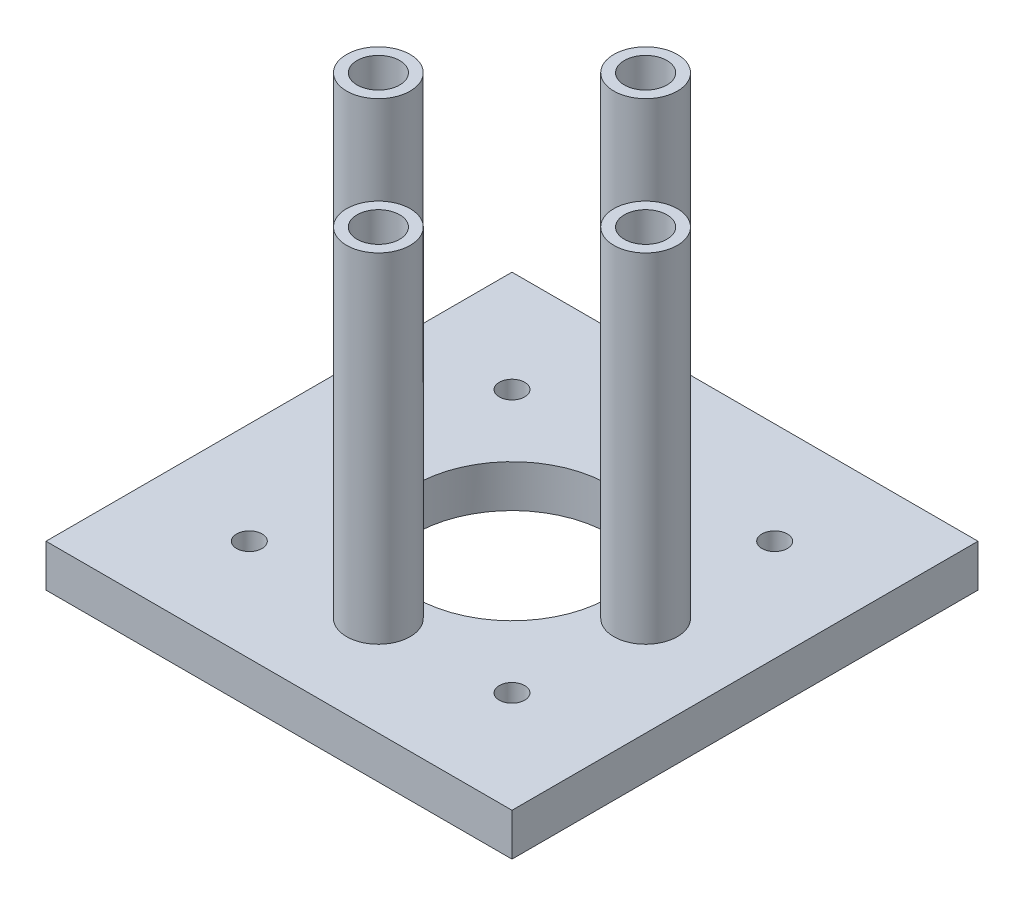
ISO-10303-21;
HEADER;
FILE_DESCRIPTION(('STEP AP214'),'2;1');
FILE_NAME('part.step','',(''),(''),'','','');
FILE_SCHEMA(('AUTOMOTIVE_DESIGN { 1 0 10303 214 1 1 1 1 }'));
ENDSEC;
DATA;
#1=APPLICATION_CONTEXT('core data for automotive mechanical design processes');
#2=APPLICATION_PROTOCOL_DEFINITION('international standard','automotive_design',2000,#1);
#3=PRODUCT_CONTEXT('',#1,'mechanical');
#4=PRODUCT('Part','Part','',(#3));
#5=PRODUCT_RELATED_PRODUCT_CATEGORY('part','',(#4));
#6=PRODUCT_DEFINITION_FORMATION('','',#4);
#7=PRODUCT_DEFINITION_CONTEXT('part definition',#1,'design');
#8=PRODUCT_DEFINITION('design','',#6,#7);
#9=PRODUCT_DEFINITION_SHAPE('','',#8);
#10=(LENGTH_UNIT() NAMED_UNIT(*) SI_UNIT(.MILLI.,.METRE.));
#11=(NAMED_UNIT(*) PLANE_ANGLE_UNIT() SI_UNIT($,.RADIAN.));
#12=(NAMED_UNIT(*) SI_UNIT($,.STERADIAN.) SOLID_ANGLE_UNIT());
#13=UNCERTAINTY_MEASURE_WITH_UNIT(LENGTH_MEASURE(1.E-05),#10,'distance_accuracy_value','');
#14=(GEOMETRIC_REPRESENTATION_CONTEXT(3) GLOBAL_UNCERTAINTY_ASSIGNED_CONTEXT((#13)) GLOBAL_UNIT_ASSIGNED_CONTEXT((#10,
#11,#12)) REPRESENTATION_CONTEXT('',''));
#15=CARTESIAN_POINT('',(0.,0.,0.));
#16=DIRECTION('',(0.,0.,1.));
#17=DIRECTION('',(1.,0.,0.));
#18=AXIS2_PLACEMENT_3D('',#15,#16,#17);
#19=CARTESIAN_POINT('',(0.,5.,0.));
#20=DIRECTION('',(0.,-1.,0.));
#21=DIRECTION('',(0.,0.,-1.));
#22=AXIS2_PLACEMENT_3D('',#19,#20,#21);
#23=PLANE('',#22);
#24=CARTESIAN_POINT('',(0.,5.,0.));
#25=DIRECTION('',(0.,1.,0.));
#26=DIRECTION('',(0.,0.,1.));
#27=AXIS2_PLACEMENT_3D('',#24,#25,#26);
#28=CIRCLE('',#27,11.5);
#29=CARTESIAN_POINT('',(0.,5.,11.5));
#30=VERTEX_POINT('',#29);
#31=EDGE_CURVE('E307',#30,#30,#28,.T.);
#32=ORIENTED_EDGE('',*,*,#31,.F.);
#33=EDGE_LOOP('',(#32));
#34=FACE_BOUND('',#33,.T.);
#35=CARTESIAN_POINT('',(0.,5.,-15.77));
#36=DIRECTION('',(0.,-1.,0.));
#37=DIRECTION('',(0.,0.,-1.));
#38=AXIS2_PLACEMENT_3D('',#35,#36,#37);
#39=CIRCLE('',#38,3.75000000000001);
#40=CARTESIAN_POINT('',(0.,5.,-19.52));
#41=VERTEX_POINT('',#40);
#42=EDGE_CURVE('E11',#41,#41,#39,.F.);
#43=ORIENTED_EDGE('',*,*,#42,.F.);
#44=EDGE_LOOP('',(#43));
#45=FACE_BOUND('',#44,.T.);
#46=CARTESIAN_POINT('',(0.,5.,15.77));
#47=DIRECTION('',(0.,-1.,0.));
#48=DIRECTION('',(0.,0.,-1.));
#49=AXIS2_PLACEMENT_3D('',#46,#47,#48);
#50=CIRCLE('',#49,3.75000000000001);
#51=CARTESIAN_POINT('',(0.,5.,12.02));
#52=VERTEX_POINT('',#51);
#53=EDGE_CURVE('E54',#52,#52,#50,.F.);
#54=ORIENTED_EDGE('',*,*,#53,.F.);
#55=EDGE_LOOP('',(#54));
#56=FACE_BOUND('',#55,.T.);
#57=CARTESIAN_POINT('',(15.77,5.,0.));
#58=DIRECTION('',(0.,-1.,0.));
#59=DIRECTION('',(0.,0.,-1.));
#60=AXIS2_PLACEMENT_3D('',#57,#58,#59);
#61=CIRCLE('',#60,3.75000000000001);
#62=CARTESIAN_POINT('',(15.77,5.,-3.75000000000001));
#63=VERTEX_POINT('',#62);
#64=EDGE_CURVE('E138',#63,#63,#61,.F.);
#65=ORIENTED_EDGE('',*,*,#64,.F.);
#66=EDGE_LOOP('',(#65));
#67=FACE_BOUND('',#66,.T.);
#68=CARTESIAN_POINT('',(-15.77,5.,0.));
#69=DIRECTION('',(0.,-1.,0.));
#70=DIRECTION('',(0.,0.,-1.));
#71=AXIS2_PLACEMENT_3D('',#68,#69,#70);
#72=CIRCLE('',#71,3.75000000000001);
#73=CARTESIAN_POINT('',(-15.77,5.,-3.75000000000001));
#74=VERTEX_POINT('',#73);
#75=EDGE_CURVE('E134',#74,#74,#72,.F.);
#76=ORIENTED_EDGE('',*,*,#75,.F.);
#77=EDGE_LOOP('',(#76));
#78=FACE_BOUND('',#77,.T.);
#79=DIRECTION('',(0.,0.,-1.));
#80=VECTOR('',#79,1.);
#81=CARTESIAN_POINT('',(27.5,5.,27.5));
#82=LINE('',#81,#80);
#83=CARTESIAN_POINT('',(27.5,5.,27.5));
#84=VERTEX_POINT('',#83);
#85=CARTESIAN_POINT('',(27.5,5.,-27.5));
#86=VERTEX_POINT('',#85);
#87=EDGE_CURVE('E98',#84,#86,#82,.T.);
#88=ORIENTED_EDGE('',*,*,#87,.T.);
#89=DIRECTION('',(-1.,0.,0.));
#90=VECTOR('',#89,1.);
#91=CARTESIAN_POINT('',(-27.5,5.,-27.5));
#92=LINE('',#91,#90);
#93=CARTESIAN_POINT('',(-27.5,5.,-27.5));
#94=VERTEX_POINT('',#93);
#95=EDGE_CURVE('E93',#86,#94,#92,.T.);
#96=ORIENTED_EDGE('',*,*,#95,.T.);
#97=DIRECTION('',(0.,0.,1.));
#98=VECTOR('',#97,1.);
#99=CARTESIAN_POINT('',(-27.5,5.,27.5));
#100=LINE('',#99,#98);
#101=CARTESIAN_POINT('',(-27.5,5.,27.5));
#102=VERTEX_POINT('',#101);
#103=EDGE_CURVE('E96',#94,#102,#100,.T.);
#104=ORIENTED_EDGE('',*,*,#103,.T.);
#105=DIRECTION('',(1.,0.,0.));
#106=VECTOR('',#105,1.);
#107=CARTESIAN_POINT('',(-27.5,5.,27.5));
#108=LINE('',#107,#106);
#109=EDGE_CURVE('E62',#102,#84,#108,.T.);
#110=ORIENTED_EDGE('',*,*,#109,.T.);
#111=EDGE_LOOP('',(#88,#96,#104,#110));
#112=FACE_BOUND('',#111,.T.);
#113=CARTESIAN_POINT('',(-15.5,5.,-15.5));
#114=DIRECTION('',(0.,1.,0.));
#115=DIRECTION('',(0.,0.,1.));
#116=AXIS2_PLACEMENT_3D('',#113,#114,#115);
#117=CIRCLE('',#116,1.5);
#118=CARTESIAN_POINT('',(-15.5,5.,-14.));
#119=VERTEX_POINT('',#118);
#120=EDGE_CURVE('E121',#119,#119,#117,.T.);
#121=ORIENTED_EDGE('',*,*,#120,.F.);
#122=EDGE_LOOP('',(#121));
#123=FACE_BOUND('',#122,.T.);
#124=CARTESIAN_POINT('',(-15.5,5.,15.5));
#125=DIRECTION('',(0.,1.,0.));
#126=DIRECTION('',(0.,0.,-1.));
#127=AXIS2_PLACEMENT_3D('',#124,#125,#126);
#128=CIRCLE('',#127,1.5);
#129=CARTESIAN_POINT('',(-15.5,5.,14.));
#130=VERTEX_POINT('',#129);
#131=EDGE_CURVE('E236',#130,#130,#128,.T.);
#132=ORIENTED_EDGE('',*,*,#131,.F.);
#133=EDGE_LOOP('',(#132));
#134=FACE_BOUND('',#133,.T.);
#135=CARTESIAN_POINT('',(15.5,5.,15.5));
#136=DIRECTION('',(0.,1.,0.));
#137=DIRECTION('',(0.,0.,1.));
#138=AXIS2_PLACEMENT_3D('',#135,#136,#137);
#139=CIRCLE('',#138,1.5);
#140=CARTESIAN_POINT('',(15.5,5.,17.));
#141=VERTEX_POINT('',#140);
#142=EDGE_CURVE('E229',#141,#141,#139,.T.);
#143=ORIENTED_EDGE('',*,*,#142,.F.);
#144=EDGE_LOOP('',(#143));
#145=FACE_BOUND('',#144,.T.);
#146=CARTESIAN_POINT('',(15.5,5.,-15.5));
#147=DIRECTION('',(0.,1.,0.));
#148=DIRECTION('',(0.,0.,-1.));
#149=AXIS2_PLACEMENT_3D('',#146,#147,#148);
#150=CIRCLE('',#149,1.5);
#151=CARTESIAN_POINT('',(15.5,5.,-17.));
#152=VERTEX_POINT('',#151);
#153=EDGE_CURVE('E217',#152,#152,#150,.T.);
#154=ORIENTED_EDGE('',*,*,#153,.F.);
#155=EDGE_LOOP('',(#154));
#156=FACE_BOUND('',#155,.T.);
#157=ADVANCED_FACE('F43',(#34,#45,#56,#67,#78,#112,#123,#134,#145,#156),#23,.F.);
#158=CARTESIAN_POINT('',(0.,0.,0.));
#159=DIRECTION('',(0.,-1.,0.));
#160=DIRECTION('',(0.,0.,-1.));
#161=AXIS2_PLACEMENT_3D('',#158,#159,#160);
#162=PLANE('',#161);
#163=CARTESIAN_POINT('',(0.,0.,0.));
#164=DIRECTION('',(0.,-1.,0.));
#165=DIRECTION('',(0.,0.,-1.));
#166=AXIS2_PLACEMENT_3D('',#163,#164,#165);
#167=CIRCLE('',#166,11.5);
#168=CARTESIAN_POINT('',(0.,0.,-11.5));
#169=VERTEX_POINT('',#168);
#170=EDGE_CURVE('E47',#169,#169,#167,.T.);
#171=ORIENTED_EDGE('',*,*,#170,.F.);
#172=EDGE_LOOP('',(#171));
#173=FACE_BOUND('',#172,.T.);
#174=CARTESIAN_POINT('',(15.5,0.,15.5));
#175=DIRECTION('',(0.,1.,0.));
#176=DIRECTION('',(0.,0.,1.));
#177=AXIS2_PLACEMENT_3D('',#174,#175,#176);
#178=CIRCLE('',#177,1.5);
#179=CARTESIAN_POINT('',(15.5,0.,17.));
#180=VERTEX_POINT('',#179);
#181=EDGE_CURVE('E223',#180,#180,#178,.T.);
#182=ORIENTED_EDGE('',*,*,#181,.T.);
#183=EDGE_LOOP('',(#182));
#184=FACE_BOUND('',#183,.T.);
#185=CARTESIAN_POINT('',(-15.5,0.,-15.5));
#186=DIRECTION('',(0.,1.,0.));
#187=DIRECTION('',(0.,0.,1.));
#188=AXIS2_PLACEMENT_3D('',#185,#186,#187);
#189=CIRCLE('',#188,1.5);
#190=CARTESIAN_POINT('',(-15.5,0.,-14.));
#191=VERTEX_POINT('',#190);
#192=EDGE_CURVE('E240',#191,#191,#189,.T.);
#193=ORIENTED_EDGE('',*,*,#192,.T.);
#194=EDGE_LOOP('',(#193));
#195=FACE_BOUND('',#194,.T.);
#196=DIRECTION('',(0.,0.,-1.));
#197=VECTOR('',#196,1.);
#198=CARTESIAN_POINT('',(27.5,0.,27.5));
#199=LINE('',#198,#197);
#200=CARTESIAN_POINT('',(27.5,0.,27.5));
#201=VERTEX_POINT('',#200);
#202=CARTESIAN_POINT('',(27.5,0.,-27.5));
#203=VERTEX_POINT('',#202);
#204=EDGE_CURVE('E117',#201,#203,#199,.T.);
#205=ORIENTED_EDGE('',*,*,#204,.F.);
#206=DIRECTION('',(1.,0.,0.));
#207=VECTOR('',#206,1.);
#208=CARTESIAN_POINT('',(-27.5,0.,27.5));
#209=LINE('',#208,#207);
#210=CARTESIAN_POINT('',(-27.5,0.,27.5));
#211=VERTEX_POINT('',#210);
#212=EDGE_CURVE('E85',#211,#201,#209,.T.);
#213=ORIENTED_EDGE('',*,*,#212,.F.);
#214=DIRECTION('',(0.,0.,1.));
#215=VECTOR('',#214,1.);
#216=CARTESIAN_POINT('',(-27.5,0.,27.5));
#217=LINE('',#216,#215);
#218=CARTESIAN_POINT('',(-27.5,0.,-27.5));
#219=VERTEX_POINT('',#218);
#220=EDGE_CURVE('E79',#219,#211,#217,.T.);
#221=ORIENTED_EDGE('',*,*,#220,.F.);
#222=DIRECTION('',(-1.,0.,0.));
#223=VECTOR('',#222,1.);
#224=CARTESIAN_POINT('',(-27.5,0.,-27.5));
#225=LINE('',#224,#223);
#226=EDGE_CURVE('E104',#203,#219,#225,.T.);
#227=ORIENTED_EDGE('',*,*,#226,.F.);
#228=EDGE_LOOP('',(#205,#213,#221,#227));
#229=FACE_BOUND('',#228,.T.);
#230=CARTESIAN_POINT('',(-15.5,0.,15.5));
#231=DIRECTION('',(0.,1.,0.));
#232=DIRECTION('',(0.,0.,-1.));
#233=AXIS2_PLACEMENT_3D('',#230,#231,#232);
#234=CIRCLE('',#233,1.5);
#235=CARTESIAN_POINT('',(-15.5,0.,14.));
#236=VERTEX_POINT('',#235);
#237=EDGE_CURVE('E211',#236,#236,#234,.T.);
#238=ORIENTED_EDGE('',*,*,#237,.T.);
#239=EDGE_LOOP('',(#238));
#240=FACE_BOUND('',#239,.T.);
#241=CARTESIAN_POINT('',(15.5,0.,-15.5));
#242=DIRECTION('',(0.,1.,0.));
#243=DIRECTION('',(0.,0.,-1.));
#244=AXIS2_PLACEMENT_3D('',#241,#242,#243);
#245=CIRCLE('',#244,1.5);
#246=CARTESIAN_POINT('',(15.5,0.,-17.));
#247=VERTEX_POINT('',#246);
#248=EDGE_CURVE('E214',#247,#247,#245,.T.);
#249=ORIENTED_EDGE('',*,*,#248,.T.);
#250=EDGE_LOOP('',(#249));
#251=FACE_BOUND('',#250,.T.);
#252=ADVANCED_FACE('F150',(#173,#184,#195,#229,#240,#251),#162,.T.);
#253=CARTESIAN_POINT('',(27.5,5.,27.5));
#254=DIRECTION('',(-1.,0.,0.));
#255=DIRECTION('',(0.,0.,1.));
#256=AXIS2_PLACEMENT_3D('',#253,#254,#255);
#257=PLANE('',#256);
#258=ORIENTED_EDGE('',*,*,#204,.T.);
#259=DIRECTION('',(0.,-1.,0.));
#260=VECTOR('',#259,1.);
#261=CARTESIAN_POINT('',(27.5,5.,-27.5));
#262=LINE('',#261,#260);
#263=EDGE_CURVE('E106',#86,#203,#262,.T.);
#264=ORIENTED_EDGE('',*,*,#263,.F.);
#265=ORIENTED_EDGE('',*,*,#87,.F.);
#266=DIRECTION('',(0.,-1.,0.));
#267=VECTOR('',#266,1.);
#268=CARTESIAN_POINT('',(27.5,5.,27.5));
#269=LINE('',#268,#267);
#270=EDGE_CURVE('E113',#84,#201,#269,.T.);
#271=ORIENTED_EDGE('',*,*,#270,.T.);
#272=EDGE_LOOP('',(#258,#264,#265,#271));
#273=FACE_BOUND('',#272,.T.);
#274=ADVANCED_FACE('F45',(#273),#257,.F.);
#275=CARTESIAN_POINT('',(-27.5,5.,-27.5));
#276=DIRECTION('',(0.,0.,1.));
#277=DIRECTION('',(1.,0.,0.));
#278=AXIS2_PLACEMENT_3D('',#275,#276,#277);
#279=PLANE('',#278);
#280=ORIENTED_EDGE('',*,*,#226,.T.);
#281=DIRECTION('',(0.,-1.,0.));
#282=VECTOR('',#281,1.);
#283=CARTESIAN_POINT('',(-27.5,5.,-27.5));
#284=LINE('',#283,#282);
#285=EDGE_CURVE('E102',#94,#219,#284,.T.);
#286=ORIENTED_EDGE('',*,*,#285,.F.);
#287=ORIENTED_EDGE('',*,*,#95,.F.);
#288=ORIENTED_EDGE('',*,*,#263,.T.);
#289=EDGE_LOOP('',(#280,#286,#287,#288));
#290=FACE_BOUND('',#289,.T.);
#291=ADVANCED_FACE('F103',(#290),#279,.F.);
#292=CARTESIAN_POINT('',(-27.5,5.,27.5));
#293=DIRECTION('',(1.,0.,0.));
#294=DIRECTION('',(0.,0.,-1.));
#295=AXIS2_PLACEMENT_3D('',#292,#293,#294);
#296=PLANE('',#295);
#297=ORIENTED_EDGE('',*,*,#220,.T.);
#298=DIRECTION('',(0.,-1.,0.));
#299=VECTOR('',#298,1.);
#300=CARTESIAN_POINT('',(-27.5,5.,27.5));
#301=LINE('',#300,#299);
#302=EDGE_CURVE('E107',#102,#211,#301,.T.);
#303=ORIENTED_EDGE('',*,*,#302,.F.);
#304=ORIENTED_EDGE('',*,*,#103,.F.);
#305=ORIENTED_EDGE('',*,*,#285,.T.);
#306=EDGE_LOOP('',(#297,#303,#304,#305));
#307=FACE_BOUND('',#306,.T.);
#308=ADVANCED_FACE('F109',(#307),#296,.F.);
#309=CARTESIAN_POINT('',(-27.5,5.,27.5));
#310=DIRECTION('',(0.,0.,-1.));
#311=DIRECTION('',(-1.,0.,0.));
#312=AXIS2_PLACEMENT_3D('',#309,#310,#311);
#313=PLANE('',#312);
#314=ORIENTED_EDGE('',*,*,#212,.T.);
#315=ORIENTED_EDGE('',*,*,#270,.F.);
#316=ORIENTED_EDGE('',*,*,#109,.F.);
#317=ORIENTED_EDGE('',*,*,#302,.T.);
#318=EDGE_LOOP('',(#314,#315,#316,#317));
#319=FACE_BOUND('',#318,.T.);
#320=ADVANCED_FACE('F189',(#319),#313,.F.);
#321=CARTESIAN_POINT('',(-15.5,5.,-15.5));
#322=DIRECTION('',(0.,-1.,0.));
#323=DIRECTION('',(0.,0.,-1.));
#324=AXIS2_PLACEMENT_3D('',#321,#322,#323);
#325=CYLINDRICAL_SURFACE('',#324,1.5);
#326=ORIENTED_EDGE('',*,*,#120,.T.);
#327=EDGE_LOOP('',(#326));
#328=FACE_BOUND('',#327,.T.);
#329=ORIENTED_EDGE('',*,*,#192,.F.);
#330=EDGE_LOOP('',(#329));
#331=FACE_BOUND('',#330,.T.);
#332=ADVANCED_FACE('F186',(#328,#331),#325,.F.);
#333=CARTESIAN_POINT('',(-15.5,5.,15.5));
#334=DIRECTION('',(0.,-1.,0.));
#335=DIRECTION('',(0.,0.,-1.));
#336=AXIS2_PLACEMENT_3D('',#333,#334,#335);
#337=CYLINDRICAL_SURFACE('',#336,1.5);
#338=ORIENTED_EDGE('',*,*,#131,.T.);
#339=EDGE_LOOP('',(#338));
#340=FACE_BOUND('',#339,.T.);
#341=ORIENTED_EDGE('',*,*,#237,.F.);
#342=EDGE_LOOP('',(#341));
#343=FACE_BOUND('',#342,.T.);
#344=ADVANCED_FACE('F182',(#340,#343),#337,.F.);
#345=CARTESIAN_POINT('',(15.5,5.,15.5));
#346=DIRECTION('',(0.,-1.,0.));
#347=DIRECTION('',(0.,0.,-1.));
#348=AXIS2_PLACEMENT_3D('',#345,#346,#347);
#349=CYLINDRICAL_SURFACE('',#348,1.5);
#350=ORIENTED_EDGE('',*,*,#142,.T.);
#351=EDGE_LOOP('',(#350));
#352=FACE_BOUND('',#351,.T.);
#353=ORIENTED_EDGE('',*,*,#181,.F.);
#354=EDGE_LOOP('',(#353));
#355=FACE_BOUND('',#354,.T.);
#356=ADVANCED_FACE('F178',(#352,#355),#349,.F.);
#357=CARTESIAN_POINT('',(15.5,5.,-15.5));
#358=DIRECTION('',(0.,-1.,0.));
#359=DIRECTION('',(0.,0.,-1.));
#360=AXIS2_PLACEMENT_3D('',#357,#358,#359);
#361=CYLINDRICAL_SURFACE('',#360,1.5);
#362=ORIENTED_EDGE('',*,*,#153,.T.);
#363=EDGE_LOOP('',(#362));
#364=FACE_BOUND('',#363,.T.);
#365=ORIENTED_EDGE('',*,*,#248,.F.);
#366=EDGE_LOOP('',(#365));
#367=FACE_BOUND('',#366,.T.);
#368=ADVANCED_FACE('F171',(#364,#367),#361,.F.);
#369=CARTESIAN_POINT('',(-15.77,45.,0.));
#370=DIRECTION('',(0.,1.,0.));
#371=DIRECTION('',(0.,0.,1.));
#372=AXIS2_PLACEMENT_3D('',#369,#370,#371);
#373=PLANE('',#372);
#374=CARTESIAN_POINT('',(-15.77,45.,0.));
#375=DIRECTION('',(0.,1.,0.));
#376=DIRECTION('',(0.,0.,1.));
#377=AXIS2_PLACEMENT_3D('',#374,#375,#376);
#378=CIRCLE('',#377,3.75000000000001);
#379=CARTESIAN_POINT('',(-15.77,45.,3.75000000000001));
#380=VERTEX_POINT('',#379);
#381=EDGE_CURVE('E218',#380,#380,#378,.T.);
#382=ORIENTED_EDGE('',*,*,#381,.T.);
#383=EDGE_LOOP('',(#382));
#384=FACE_BOUND('',#383,.T.);
#385=CARTESIAN_POINT('',(-15.77,45.,0.));
#386=DIRECTION('',(0.,1.,0.));
#387=DIRECTION('',(0.,0.,1.));
#388=AXIS2_PLACEMENT_3D('',#385,#386,#387);
#389=CIRCLE('',#388,2.51184584015954);
#390=CARTESIAN_POINT('',(-15.77,45.,2.51184584015954));
#391=VERTEX_POINT('',#390);
#392=EDGE_CURVE('E226',#391,#391,#389,.T.);
#393=ORIENTED_EDGE('',*,*,#392,.F.);
#394=EDGE_LOOP('',(#393));
#395=FACE_BOUND('',#394,.T.);
#396=ADVANCED_FACE('F162',(#384,#395),#373,.T.);
#397=CARTESIAN_POINT('',(-15.77,45.,0.));
#398=DIRECTION('',(0.,-1.,0.));
#399=DIRECTION('',(0.,0.,-1.));
#400=AXIS2_PLACEMENT_3D('',#397,#398,#399);
#401=CYLINDRICAL_SURFACE('',#400,3.75000000000001);
#402=ORIENTED_EDGE('',*,*,#381,.F.);
#403=EDGE_LOOP('',(#402));
#404=FACE_BOUND('',#403,.T.);
#405=ORIENTED_EDGE('',*,*,#75,.T.);
#406=EDGE_LOOP('',(#405));
#407=FACE_BOUND('',#406,.T.);
#408=ADVANCED_FACE('F159',(#404,#407),#401,.T.);
#409=CARTESIAN_POINT('',(-15.77,45.,0.));
#410=DIRECTION('',(0.,-1.,0.));
#411=DIRECTION('',(0.,0.,-1.));
#412=AXIS2_PLACEMENT_3D('',#409,#410,#411);
#413=CYLINDRICAL_SURFACE('',#412,2.51184584015954);
#414=ORIENTED_EDGE('',*,*,#392,.T.);
#415=EDGE_LOOP('',(#414));
#416=FACE_BOUND('',#415,.T.);
#417=CARTESIAN_POINT('',(-15.77,5.,0.));
#418=DIRECTION('',(0.,1.,0.));
#419=DIRECTION('',(0.,0.,1.));
#420=AXIS2_PLACEMENT_3D('',#417,#418,#419);
#421=CIRCLE('',#420,2.51184584015954);
#422=CARTESIAN_POINT('',(-15.77,5.,2.51184584015954));
#423=VERTEX_POINT('',#422);
#424=EDGE_CURVE('E264',#423,#423,#421,.T.);
#425=ORIENTED_EDGE('',*,*,#424,.F.);
#426=EDGE_LOOP('',(#425));
#427=FACE_BOUND('',#426,.T.);
#428=ADVANCED_FACE('F161',(#416,#427),#413,.F.);
#429=ORIENTED_EDGE('',*,*,#424,.T.);
#430=EDGE_LOOP('',(#429));
#431=FACE_BOUND('',#430,.T.);
#432=ADVANCED_FACE('F154',(#431),#23,.F.);
#433=CARTESIAN_POINT('',(15.77,45.,0.));
#434=DIRECTION('',(0.,-1.,0.));
#435=DIRECTION('',(0.,0.,-1.));
#436=AXIS2_PLACEMENT_3D('',#433,#434,#435);
#437=PLANE('',#436);
#438=CARTESIAN_POINT('',(15.77,45.,0.));
#439=DIRECTION('',(0.,1.,0.));
#440=DIRECTION('',(0.,0.,-1.));
#441=AXIS2_PLACEMENT_3D('',#438,#439,#440);
#442=CIRCLE('',#441,3.75000000000001);
#443=CARTESIAN_POINT('',(15.77,45.,-3.75000000000001));
#444=VERTEX_POINT('',#443);
#445=EDGE_CURVE('E276',#444,#444,#442,.T.);
#446=ORIENTED_EDGE('',*,*,#445,.T.);
#447=EDGE_LOOP('',(#446));
#448=FACE_BOUND('',#447,.T.);
#449=CARTESIAN_POINT('',(15.77,45.,0.));
#450=DIRECTION('',(0.,1.,0.));
#451=DIRECTION('',(0.,0.,-1.));
#452=AXIS2_PLACEMENT_3D('',#449,#450,#451);
#453=CIRCLE('',#452,2.51184584015954);
#454=CARTESIAN_POINT('',(15.77,45.,-2.51184584015954));
#455=VERTEX_POINT('',#454);
#456=EDGE_CURVE('E272',#455,#455,#453,.T.);
#457=ORIENTED_EDGE('',*,*,#456,.F.);
#458=EDGE_LOOP('',(#457));
#459=FACE_BOUND('',#458,.T.);
#460=ADVANCED_FACE('F353',(#448,#459),#437,.F.);
#461=CARTESIAN_POINT('',(15.77,45.,0.));
#462=DIRECTION('',(0.,-1.,0.));
#463=DIRECTION('',(0.,0.,-1.));
#464=AXIS2_PLACEMENT_3D('',#461,#462,#463);
#465=CYLINDRICAL_SURFACE('',#464,3.75000000000001);
#466=ORIENTED_EDGE('',*,*,#445,.F.);
#467=EDGE_LOOP('',(#466));
#468=FACE_BOUND('',#467,.T.);
#469=ORIENTED_EDGE('',*,*,#64,.T.);
#470=EDGE_LOOP('',(#469));
#471=FACE_BOUND('',#470,.T.);
#472=ADVANCED_FACE('F349',(#468,#471),#465,.T.);
#473=CARTESIAN_POINT('',(15.77,45.,0.));
#474=DIRECTION('',(0.,-1.,0.));
#475=DIRECTION('',(0.,0.,-1.));
#476=AXIS2_PLACEMENT_3D('',#473,#474,#475);
#477=CYLINDRICAL_SURFACE('',#476,2.51184584015954);
#478=ORIENTED_EDGE('',*,*,#456,.T.);
#479=EDGE_LOOP('',(#478));
#480=FACE_BOUND('',#479,.T.);
#481=CARTESIAN_POINT('',(15.77,5.,0.));
#482=DIRECTION('',(0.,1.,0.));
#483=DIRECTION('',(0.,0.,-1.));
#484=AXIS2_PLACEMENT_3D('',#481,#482,#483);
#485=CIRCLE('',#484,2.51184584015954);
#486=CARTESIAN_POINT('',(15.77,5.,-2.51184584015954));
#487=VERTEX_POINT('',#486);
#488=EDGE_CURVE('E268',#487,#487,#485,.T.);
#489=ORIENTED_EDGE('',*,*,#488,.F.);
#490=EDGE_LOOP('',(#489));
#491=FACE_BOUND('',#490,.T.);
#492=ADVANCED_FACE('F352',(#480,#491),#477,.F.);
#493=ORIENTED_EDGE('',*,*,#488,.T.);
#494=EDGE_LOOP('',(#493));
#495=FACE_BOUND('',#494,.T.);
#496=ADVANCED_FACE('F344',(#495),#23,.F.);
#497=CARTESIAN_POINT('',(0.,45.,15.77));
#498=DIRECTION('',(0.,1.,0.));
#499=DIRECTION('',(0.,0.,1.));
#500=AXIS2_PLACEMENT_3D('',#497,#498,#499);
#501=PLANE('',#500);
#502=CARTESIAN_POINT('',(0.,45.,15.77));
#503=DIRECTION('',(0.,1.,0.));
#504=DIRECTION('',(0.,0.,1.));
#505=AXIS2_PLACEMENT_3D('',#502,#503,#504);
#506=CIRCLE('',#505,3.75000000000001);
#507=CARTESIAN_POINT('',(0.,45.,19.52));
#508=VERTEX_POINT('',#507);
#509=EDGE_CURVE('E288',#508,#508,#506,.T.);
#510=ORIENTED_EDGE('',*,*,#509,.T.);
#511=EDGE_LOOP('',(#510));
#512=FACE_BOUND('',#511,.T.);
#513=CARTESIAN_POINT('',(0.,45.,15.77));
#514=DIRECTION('',(0.,1.,0.));
#515=DIRECTION('',(0.,0.,1.));
#516=AXIS2_PLACEMENT_3D('',#513,#514,#515);
#517=CIRCLE('',#516,2.51184584015954);
#518=CARTESIAN_POINT('',(0.,45.,18.2818458401595));
#519=VERTEX_POINT('',#518);
#520=EDGE_CURVE('E284',#519,#519,#517,.T.);
#521=ORIENTED_EDGE('',*,*,#520,.F.);
#522=EDGE_LOOP('',(#521));
#523=FACE_BOUND('',#522,.T.);
#524=ADVANCED_FACE('F340',(#512,#523),#501,.T.);
#525=CARTESIAN_POINT('',(0.,45.,15.77));
#526=DIRECTION('',(0.,-1.,0.));
#527=DIRECTION('',(0.,0.,-1.));
#528=AXIS2_PLACEMENT_3D('',#525,#526,#527);
#529=CYLINDRICAL_SURFACE('',#528,3.75000000000001);
#530=ORIENTED_EDGE('',*,*,#509,.F.);
#531=EDGE_LOOP('',(#530));
#532=FACE_BOUND('',#531,.T.);
#533=ORIENTED_EDGE('',*,*,#53,.T.);
#534=EDGE_LOOP('',(#533));
#535=FACE_BOUND('',#534,.T.);
#536=ADVANCED_FACE('F146',(#532,#535),#529,.T.);
#537=CARTESIAN_POINT('',(0.,45.,15.77));
#538=DIRECTION('',(0.,-1.,0.));
#539=DIRECTION('',(0.,0.,-1.));
#540=AXIS2_PLACEMENT_3D('',#537,#538,#539);
#541=CYLINDRICAL_SURFACE('',#540,2.51184584015954);
#542=ORIENTED_EDGE('',*,*,#520,.T.);
#543=EDGE_LOOP('',(#542));
#544=FACE_BOUND('',#543,.T.);
#545=CARTESIAN_POINT('',(0.,5.,15.77));
#546=DIRECTION('',(0.,1.,0.));
#547=DIRECTION('',(0.,0.,1.));
#548=AXIS2_PLACEMENT_3D('',#545,#546,#547);
#549=CIRCLE('',#548,2.51184584015954);
#550=CARTESIAN_POINT('',(0.,5.,18.2818458401595));
#551=VERTEX_POINT('',#550);
#552=EDGE_CURVE('E283',#551,#551,#549,.T.);
#553=ORIENTED_EDGE('',*,*,#552,.F.);
#554=EDGE_LOOP('',(#553));
#555=FACE_BOUND('',#554,.T.);
#556=ADVANCED_FACE('F339',(#544,#555),#541,.F.);
#557=ORIENTED_EDGE('',*,*,#552,.T.);
#558=EDGE_LOOP('',(#557));
#559=FACE_BOUND('',#558,.T.);
#560=ADVANCED_FACE('F324',(#559),#23,.F.);
#561=CARTESIAN_POINT('',(0.,45.,-15.77));
#562=DIRECTION('',(0.,-1.,0.));
#563=DIRECTION('',(0.,0.,-1.));
#564=AXIS2_PLACEMENT_3D('',#561,#562,#563);
#565=PLANE('',#564);
#566=CARTESIAN_POINT('',(0.,45.,-15.77));
#567=DIRECTION('',(0.,1.,0.));
#568=DIRECTION('',(0.,0.,-1.));
#569=AXIS2_PLACEMENT_3D('',#566,#567,#568);
#570=CIRCLE('',#569,3.75000000000001);
#571=CARTESIAN_POINT('',(0.,45.,-19.52));
#572=VERTEX_POINT('',#571);
#573=EDGE_CURVE('E300',#572,#572,#570,.T.);
#574=ORIENTED_EDGE('',*,*,#573,.T.);
#575=EDGE_LOOP('',(#574));
#576=FACE_BOUND('',#575,.T.);
#577=CARTESIAN_POINT('',(0.,45.,-15.77));
#578=DIRECTION('',(0.,1.,0.));
#579=DIRECTION('',(0.,0.,-1.));
#580=AXIS2_PLACEMENT_3D('',#577,#578,#579);
#581=CIRCLE('',#580,2.51184584015954);
#582=CARTESIAN_POINT('',(0.,45.,-18.2818458401595));
#583=VERTEX_POINT('',#582);
#584=EDGE_CURVE('E296',#583,#583,#581,.T.);
#585=ORIENTED_EDGE('',*,*,#584,.F.);
#586=EDGE_LOOP('',(#585));
#587=FACE_BOUND('',#586,.T.);
#588=ADVANCED_FACE('F329',(#576,#587),#565,.F.);
#589=CARTESIAN_POINT('',(0.,45.,-15.77));
#590=DIRECTION('',(0.,-1.,0.));
#591=DIRECTION('',(0.,0.,-1.));
#592=AXIS2_PLACEMENT_3D('',#589,#590,#591);
#593=CYLINDRICAL_SURFACE('',#592,3.75000000000001);
#594=ORIENTED_EDGE('',*,*,#573,.F.);
#595=EDGE_LOOP('',(#594));
#596=FACE_BOUND('',#595,.T.);
#597=ORIENTED_EDGE('',*,*,#42,.T.);
#598=EDGE_LOOP('',(#597));
#599=FACE_BOUND('',#598,.T.);
#600=ADVANCED_FACE('F326',(#596,#599),#593,.T.);
#601=CARTESIAN_POINT('',(0.,45.,-15.77));
#602=DIRECTION('',(0.,-1.,0.));
#603=DIRECTION('',(0.,0.,-1.));
#604=AXIS2_PLACEMENT_3D('',#601,#602,#603);
#605=CYLINDRICAL_SURFACE('',#604,2.51184584015954);
#606=ORIENTED_EDGE('',*,*,#584,.T.);
#607=EDGE_LOOP('',(#606));
#608=FACE_BOUND('',#607,.T.);
#609=CARTESIAN_POINT('',(0.,5.,-15.77));
#610=DIRECTION('',(0.,1.,0.));
#611=DIRECTION('',(0.,0.,-1.));
#612=AXIS2_PLACEMENT_3D('',#609,#610,#611);
#613=CIRCLE('',#612,2.51184584015954);
#614=CARTESIAN_POINT('',(0.,5.,-18.2818458401595));
#615=VERTEX_POINT('',#614);
#616=EDGE_CURVE('E295',#615,#615,#613,.T.);
#617=ORIENTED_EDGE('',*,*,#616,.F.);
#618=EDGE_LOOP('',(#617));
#619=FACE_BOUND('',#618,.T.);
#620=ADVANCED_FACE('F322',(#608,#619),#605,.F.);
#621=ORIENTED_EDGE('',*,*,#616,.T.);
#622=EDGE_LOOP('',(#621));
#623=FACE_BOUND('',#622,.T.);
#624=ADVANCED_FACE('F153',(#623),#23,.F.);
#625=CARTESIAN_POINT('',(0.,-10.,0.));
#626=DIRECTION('',(0.,1.,0.));
#627=DIRECTION('',(0.,0.,1.));
#628=AXIS2_PLACEMENT_3D('',#625,#626,#627);
#629=CYLINDRICAL_SURFACE('',#628,11.5);
#630=ORIENTED_EDGE('',*,*,#170,.T.);
#631=EDGE_LOOP('',(#630));
#632=FACE_BOUND('',#631,.T.);
#633=ORIENTED_EDGE('',*,*,#31,.T.);
#634=EDGE_LOOP('',(#633));
#635=FACE_BOUND('',#634,.T.);
#636=ADVANCED_FACE('F316',(#632,#635),#629,.F.);
#637=CLOSED_SHELL('',(#157,#252,#274,#291,#308,#320,#332,#344,#356,#368,#396,#408,#428,#432,
#460,#472,#492,#496,#524,#536,#556,#560,#588,#600,#620,#624,#636));
#638=MANIFOLD_SOLID_BREP('B2',#637);
#639=ADVANCED_BREP_SHAPE_REPRESENTATION('',(#18,#638),#14);
#640=SHAPE_DEFINITION_REPRESENTATION(#9,#639);
ENDSEC;
END-ISO-10303-21;
